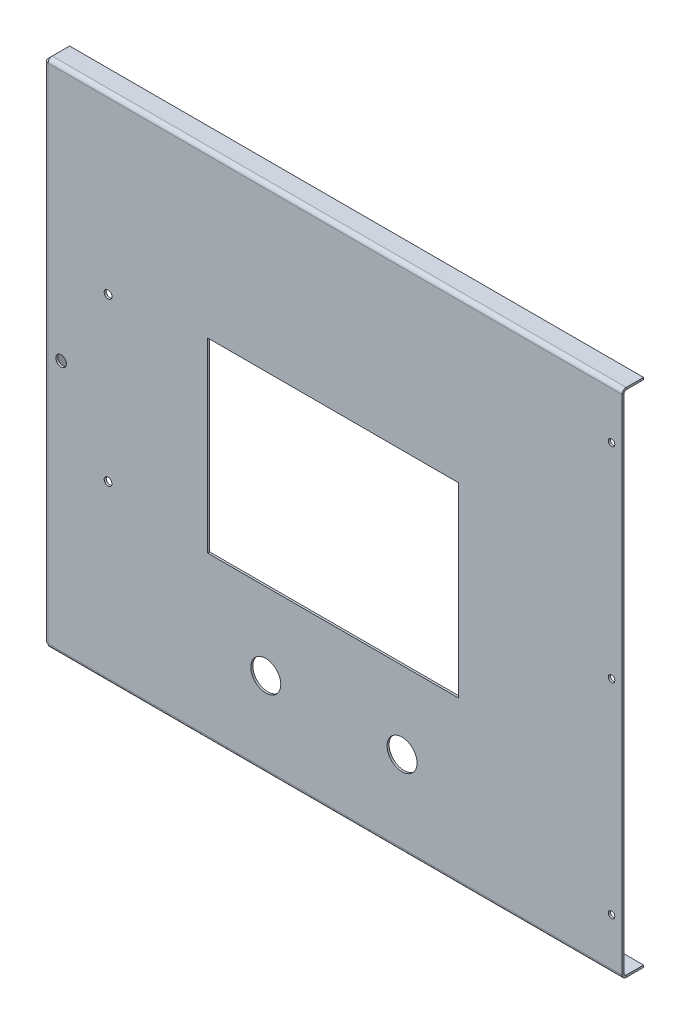
ISO-10303-21;
HEADER;
FILE_DESCRIPTION(('STEP AP214'),'2;1');
FILE_NAME('part.step','',(''),(''),'','','');
FILE_SCHEMA(('AUTOMOTIVE_DESIGN { 1 0 10303 214 1 1 1 1 }'));
ENDSEC;
DATA;
#1=APPLICATION_CONTEXT('core data for automotive mechanical design processes');
#2=APPLICATION_PROTOCOL_DEFINITION('international standard','automotive_design',2000,#1);
#3=PRODUCT_CONTEXT('',#1,'mechanical');
#4=PRODUCT('Part','Part','',(#3));
#5=PRODUCT_RELATED_PRODUCT_CATEGORY('part','',(#4));
#6=PRODUCT_DEFINITION_FORMATION('','',#4);
#7=PRODUCT_DEFINITION_CONTEXT('part definition',#1,'design');
#8=PRODUCT_DEFINITION('design','',#6,#7);
#9=PRODUCT_DEFINITION_SHAPE('','',#8);
#10=(LENGTH_UNIT() NAMED_UNIT(*) SI_UNIT(.MILLI.,.METRE.));
#11=(NAMED_UNIT(*) PLANE_ANGLE_UNIT() SI_UNIT($,.RADIAN.));
#12=(NAMED_UNIT(*) SI_UNIT($,.STERADIAN.) SOLID_ANGLE_UNIT());
#13=UNCERTAINTY_MEASURE_WITH_UNIT(LENGTH_MEASURE(1.E-05),#10,'distance_accuracy_value','');
#14=(GEOMETRIC_REPRESENTATION_CONTEXT(3) GLOBAL_UNCERTAINTY_ASSIGNED_CONTEXT((#13)) GLOBAL_UNIT_ASSIGNED_CONTEXT((#10,
#11,#12)) REPRESENTATION_CONTEXT('',''));
#15=CARTESIAN_POINT('',(0.,0.,0.));
#16=DIRECTION('',(0.,0.,1.));
#17=DIRECTION('',(1.,0.,0.));
#18=AXIS2_PLACEMENT_3D('',#15,#16,#17);
#19=CARTESIAN_POINT('',(0.,0.,-1.524));
#20=DIRECTION('',(0.,0.,-1.));
#21=DIRECTION('',(-1.,0.,0.));
#22=AXIS2_PLACEMENT_3D('',#19,#20,#21);
#23=PLANE('',#22);
#24=CARTESIAN_POINT('',(51.435,-127.,-1.524));
#25=DIRECTION('',(0.,0.,-1.));
#26=DIRECTION('',(-1.,0.,0.));
#27=AXIS2_PLACEMENT_3D('',#24,#25,#26);
#28=CIRCLE('',#27,11.176);
#29=CARTESIAN_POINT('',(40.259,-127.,-1.524));
#30=VERTEX_POINT('',#29);
#31=EDGE_CURVE('E320',#30,#30,#28,.T.);
#32=ORIENTED_EDGE('',*,*,#31,.F.);
#33=EDGE_LOOP('',(#32));
#34=FACE_BOUND('',#33,.T.);
#35=CARTESIAN_POINT('',(207.645,152.4,-1.524));
#36=DIRECTION('',(0.,0.,-1.));
#37=DIRECTION('',(-1.,0.,0.));
#38=AXIS2_PLACEMENT_3D('',#35,#36,#37);
#39=CIRCLE('',#38,2.413);
#40=CARTESIAN_POINT('',(205.232,152.4,-1.524));
#41=VERTEX_POINT('',#40);
#42=EDGE_CURVE('E316',#41,#41,#39,.T.);
#43=ORIENTED_EDGE('',*,*,#42,.F.);
#44=EDGE_LOOP('',(#43));
#45=FACE_BOUND('',#44,.T.);
#46=CARTESIAN_POINT('',(207.645,0.,-1.524));
#47=DIRECTION('',(0.,0.,-1.));
#48=DIRECTION('',(-1.,0.,0.));
#49=AXIS2_PLACEMENT_3D('',#46,#47,#48);
#50=CIRCLE('',#49,2.413);
#51=CARTESIAN_POINT('',(205.232,0.,-1.524));
#52=VERTEX_POINT('',#51);
#53=EDGE_CURVE('E312',#52,#52,#50,.T.);
#54=ORIENTED_EDGE('',*,*,#53,.F.);
#55=EDGE_LOOP('',(#54));
#56=FACE_BOUND('',#55,.T.);
#57=CARTESIAN_POINT('',(207.645,-152.4,-1.524));
#58=DIRECTION('',(0.,0.,-1.));
#59=DIRECTION('',(-1.,0.,0.));
#60=AXIS2_PLACEMENT_3D('',#57,#58,#59);
#61=CIRCLE('',#60,2.413);
#62=CARTESIAN_POINT('',(205.232,-152.4,-1.524));
#63=VERTEX_POINT('',#62);
#64=EDGE_CURVE('E308',#63,#63,#61,.T.);
#65=ORIENTED_EDGE('',*,*,#64,.F.);
#66=EDGE_LOOP('',(#65));
#67=FACE_BOUND('',#66,.T.);
#68=CARTESIAN_POINT('',(-50.165,-127.,-1.524));
#69=DIRECTION('',(0.,0.,-1.));
#70=DIRECTION('',(-1.,0.,0.));
#71=AXIS2_PLACEMENT_3D('',#68,#69,#70);
#72=CIRCLE('',#71,11.176);
#73=CARTESIAN_POINT('',(-61.341,-127.,-1.524));
#74=VERTEX_POINT('',#73);
#75=EDGE_CURVE('E304',#74,#74,#72,.T.);
#76=ORIENTED_EDGE('',*,*,#75,.F.);
#77=EDGE_LOOP('',(#76));
#78=FACE_BOUND('',#77,.T.);
#79=CARTESIAN_POINT('',(-167.767,-60.452,-1.524));
#80=DIRECTION('',(0.,0.,-1.));
#81=DIRECTION('',(-1.,0.,0.));
#82=AXIS2_PLACEMENT_3D('',#79,#80,#81);
#83=CIRCLE('',#82,2.8956);
#84=CARTESIAN_POINT('',(-170.6626,-60.452,-1.524));
#85=VERTEX_POINT('',#84);
#86=EDGE_CURVE('E300',#85,#85,#83,.T.);
#87=ORIENTED_EDGE('',*,*,#86,.F.);
#88=EDGE_LOOP('',(#87));
#89=FACE_BOUND('',#88,.T.);
#90=CARTESIAN_POINT('',(-167.767,60.452,-1.524));
#91=DIRECTION('',(0.,0.,-1.));
#92=DIRECTION('',(-1.,0.,0.));
#93=AXIS2_PLACEMENT_3D('',#90,#91,#92);
#94=CIRCLE('',#93,2.8956);
#95=CARTESIAN_POINT('',(-170.6626,60.452,-1.524));
#96=VERTEX_POINT('',#95);
#97=EDGE_CURVE('E296',#96,#96,#94,.T.);
#98=ORIENTED_EDGE('',*,*,#97,.F.);
#99=EDGE_LOOP('',(#98));
#100=FACE_BOUND('',#99,.T.);
#101=CARTESIAN_POINT('',(-202.819,0.,-1.524));
#102=DIRECTION('',(0.,0.,-1.));
#103=DIRECTION('',(-1.,0.,0.));
#104=AXIS2_PLACEMENT_3D('',#101,#102,#103);
#105=CIRCLE('',#104,3.9624);
#106=CARTESIAN_POINT('',(-206.7814,0.,-1.524));
#107=VERTEX_POINT('',#106);
#108=EDGE_CURVE('E292',#107,#107,#105,.T.);
#109=ORIENTED_EDGE('',*,*,#108,.F.);
#110=EDGE_LOOP('',(#109));
#111=FACE_BOUND('',#110,.T.);
#112=DIRECTION('',(0.,-1.,0.));
#113=VECTOR('',#112,1.);
#114=CARTESIAN_POINT('',(93.345,0.,-1.524));
#115=LINE('',#114,#113);
#116=CARTESIAN_POINT('',(93.345,69.469,-1.524));
#117=VERTEX_POINT('',#116);
#118=CARTESIAN_POINT('',(93.345,-69.469,-1.524));
#119=VERTEX_POINT('',#118);
#120=EDGE_CURVE('E289',#117,#119,#115,.T.);
#121=ORIENTED_EDGE('',*,*,#120,.F.);
#122=DIRECTION('',(1.,0.,0.));
#123=VECTOR('',#122,1.);
#124=CARTESIAN_POINT('',(0.,69.469,-1.524));
#125=LINE('',#124,#123);
#126=CARTESIAN_POINT('',(-93.599,69.469,-1.524));
#127=VERTEX_POINT('',#126);
#128=EDGE_CURVE('E277',#127,#117,#125,.T.);
#129=ORIENTED_EDGE('',*,*,#128,.F.);
#130=DIRECTION('',(0.,1.,0.));
#131=VECTOR('',#130,1.);
#132=CARTESIAN_POINT('',(-93.599,0.,-1.524));
#133=LINE('',#132,#131);
#134=CARTESIAN_POINT('',(-93.599,-69.469,-1.524));
#135=VERTEX_POINT('',#134);
#136=EDGE_CURVE('E249',#135,#127,#133,.T.);
#137=ORIENTED_EDGE('',*,*,#136,.F.);
#138=DIRECTION('',(-1.,0.,0.));
#139=VECTOR('',#138,1.);
#140=CARTESIAN_POINT('',(0.,-69.469,-1.524));
#141=LINE('',#140,#139);
#142=EDGE_CURVE('E286',#119,#135,#141,.T.);
#143=ORIENTED_EDGE('',*,*,#142,.F.);
#144=EDGE_LOOP('',(#121,#129,#137,#143));
#145=FACE_BOUND('',#144,.T.);
#146=DIRECTION('',(0.,1.,0.));
#147=VECTOR('',#146,1.);
#148=CARTESIAN_POINT('',(215.519,-190.5,-1.524));
#149=LINE('',#148,#147);
#150=CARTESIAN_POINT('',(215.519,-187.452,-1.524));
#151=VERTEX_POINT('',#150);
#152=CARTESIAN_POINT('',(215.519,187.452,-1.524));
#153=VERTEX_POINT('',#152);
#154=EDGE_CURVE('E13',#151,#153,#149,.T.);
#155=ORIENTED_EDGE('',*,*,#154,.F.);
#156=DIRECTION('',(1.,0.,0.));
#157=VECTOR('',#156,1.);
#158=CARTESIAN_POINT('',(-212.471,-187.452,-1.52400000000002));
#159=LINE('',#158,#157);
#160=CARTESIAN_POINT('',(-212.471,-187.452,-1.524));
#161=VERTEX_POINT('',#160);
#162=EDGE_CURVE('E522',#161,#151,#159,.T.);
#163=ORIENTED_EDGE('',*,*,#162,.F.);
#164=DIRECTION('',(0.,-1.,0.));
#165=VECTOR('',#164,1.);
#166=CARTESIAN_POINT('',(-212.471,187.452,-1.524));
#167=LINE('',#166,#165);
#168=CARTESIAN_POINT('',(-212.471,187.452,-1.524));
#169=VERTEX_POINT('',#168);
#170=EDGE_CURVE('E532',#169,#161,#167,.T.);
#171=ORIENTED_EDGE('',*,*,#170,.F.);
#172=DIRECTION('',(1.,0.,0.));
#173=VECTOR('',#172,1.);
#174=CARTESIAN_POINT('',(215.519,187.452,-1.524));
#175=LINE('',#174,#173);
#176=EDGE_CURVE('E511',#153,#169,#175,.F.);
#177=ORIENTED_EDGE('',*,*,#176,.F.);
#178=EDGE_LOOP('',(#155,#163,#171,#177));
#179=FACE_BOUND('',#178,.T.);
#180=ADVANCED_FACE('F106',(#34,#45,#56,#67,#78,#89,#100,#111,#145,#179),#23,.T.);
#181=CARTESIAN_POINT('',(0.,0.,0.));
#182=DIRECTION('',(0.,0.,-1.));
#183=DIRECTION('',(-1.,0.,0.));
#184=AXIS2_PLACEMENT_3D('',#181,#182,#183);
#185=PLANE('',#184);
#186=CARTESIAN_POINT('',(51.435,-127.,0.));
#187=DIRECTION('',(0.,0.,1.));
#188=DIRECTION('',(1.,0.,0.));
#189=AXIS2_PLACEMENT_3D('',#186,#187,#188);
#190=CIRCLE('',#189,11.176);
#191=CARTESIAN_POINT('',(62.611,-127.,0.));
#192=VERTEX_POINT('',#191);
#193=EDGE_CURVE('E1129',#192,#192,#190,.T.);
#194=ORIENTED_EDGE('',*,*,#193,.F.);
#195=EDGE_LOOP('',(#194));
#196=FACE_BOUND('',#195,.T.);
#197=CARTESIAN_POINT('',(207.645,152.4,0.));
#198=DIRECTION('',(0.,0.,1.));
#199=DIRECTION('',(1.,0.,0.));
#200=AXIS2_PLACEMENT_3D('',#197,#198,#199);
#201=CIRCLE('',#200,2.413);
#202=CARTESIAN_POINT('',(210.058,152.4,0.));
#203=VERTEX_POINT('',#202);
#204=EDGE_CURVE('E1132',#203,#203,#201,.T.);
#205=ORIENTED_EDGE('',*,*,#204,.F.);
#206=EDGE_LOOP('',(#205));
#207=FACE_BOUND('',#206,.T.);
#208=CARTESIAN_POINT('',(207.645,0.,0.));
#209=DIRECTION('',(0.,0.,1.));
#210=DIRECTION('',(1.,0.,0.));
#211=AXIS2_PLACEMENT_3D('',#208,#209,#210);
#212=CIRCLE('',#211,2.413);
#213=CARTESIAN_POINT('',(210.058,0.,0.));
#214=VERTEX_POINT('',#213);
#215=EDGE_CURVE('E1141',#214,#214,#212,.T.);
#216=ORIENTED_EDGE('',*,*,#215,.F.);
#217=EDGE_LOOP('',(#216));
#218=FACE_BOUND('',#217,.T.);
#219=CARTESIAN_POINT('',(207.645,-152.4,0.));
#220=DIRECTION('',(0.,0.,1.));
#221=DIRECTION('',(1.,0.,0.));
#222=AXIS2_PLACEMENT_3D('',#219,#220,#221);
#223=CIRCLE('',#222,2.413);
#224=CARTESIAN_POINT('',(210.058,-152.4,0.));
#225=VERTEX_POINT('',#224);
#226=EDGE_CURVE('E1144',#225,#225,#223,.T.);
#227=ORIENTED_EDGE('',*,*,#226,.F.);
#228=EDGE_LOOP('',(#227));
#229=FACE_BOUND('',#228,.T.);
#230=CARTESIAN_POINT('',(-50.165,-127.,0.));
#231=DIRECTION('',(0.,0.,1.));
#232=DIRECTION('',(1.,0.,0.));
#233=AXIS2_PLACEMENT_3D('',#230,#231,#232);
#234=CIRCLE('',#233,11.176);
#235=CARTESIAN_POINT('',(-38.989,-127.,0.));
#236=VERTEX_POINT('',#235);
#237=EDGE_CURVE('E1131',#236,#236,#234,.T.);
#238=ORIENTED_EDGE('',*,*,#237,.F.);
#239=EDGE_LOOP('',(#238));
#240=FACE_BOUND('',#239,.T.);
#241=CARTESIAN_POINT('',(-167.767,-60.452,0.));
#242=DIRECTION('',(0.,0.,1.));
#243=DIRECTION('',(1.,0.,0.));
#244=AXIS2_PLACEMENT_3D('',#241,#242,#243);
#245=CIRCLE('',#244,2.8956);
#246=CARTESIAN_POINT('',(-164.8714,-60.452,0.));
#247=VERTEX_POINT('',#246);
#248=EDGE_CURVE('E1137',#247,#247,#245,.T.);
#249=ORIENTED_EDGE('',*,*,#248,.F.);
#250=EDGE_LOOP('',(#249));
#251=FACE_BOUND('',#250,.T.);
#252=CARTESIAN_POINT('',(-167.767,60.452,0.));
#253=DIRECTION('',(0.,0.,1.));
#254=DIRECTION('',(1.,0.,0.));
#255=AXIS2_PLACEMENT_3D('',#252,#253,#254);
#256=CIRCLE('',#255,2.8956);
#257=CARTESIAN_POINT('',(-164.8714,60.452,0.));
#258=VERTEX_POINT('',#257);
#259=EDGE_CURVE('E1151',#258,#258,#256,.T.);
#260=ORIENTED_EDGE('',*,*,#259,.F.);
#261=EDGE_LOOP('',(#260));
#262=FACE_BOUND('',#261,.T.);
#263=CARTESIAN_POINT('',(-202.819,0.,0.));
#264=DIRECTION('',(0.,0.,1.));
#265=DIRECTION('',(1.,0.,0.));
#266=AXIS2_PLACEMENT_3D('',#263,#264,#265);
#267=CIRCLE('',#266,3.9624);
#268=CARTESIAN_POINT('',(-198.8566,0.,0.));
#269=VERTEX_POINT('',#268);
#270=EDGE_CURVE('E1147',#269,#269,#267,.T.);
#271=ORIENTED_EDGE('',*,*,#270,.F.);
#272=EDGE_LOOP('',(#271));
#273=FACE_BOUND('',#272,.T.);
#274=DIRECTION('',(-1.,0.,0.));
#275=VECTOR('',#274,1.);
#276=CARTESIAN_POINT('',(-93.599,69.469,0.));
#277=LINE('',#276,#275);
#278=CARTESIAN_POINT('',(93.345,69.469,0.));
#279=VERTEX_POINT('',#278);
#280=CARTESIAN_POINT('',(-93.599,69.469,0.));
#281=VERTEX_POINT('',#280);
#282=EDGE_CURVE('E256',#279,#281,#277,.T.);
#283=ORIENTED_EDGE('',*,*,#282,.F.);
#284=DIRECTION('',(0.,1.,0.));
#285=VECTOR('',#284,1.);
#286=CARTESIAN_POINT('',(93.345,-69.469,0.));
#287=LINE('',#286,#285);
#288=CARTESIAN_POINT('',(93.345,-69.469,0.));
#289=VERTEX_POINT('',#288);
#290=EDGE_CURVE('E130',#289,#279,#287,.T.);
#291=ORIENTED_EDGE('',*,*,#290,.F.);
#292=DIRECTION('',(1.,0.,0.));
#293=VECTOR('',#292,1.);
#294=CARTESIAN_POINT('',(-93.599,-69.469,0.));
#295=LINE('',#294,#293);
#296=CARTESIAN_POINT('',(-93.599,-69.469,0.));
#297=VERTEX_POINT('',#296);
#298=EDGE_CURVE('E264',#297,#289,#295,.T.);
#299=ORIENTED_EDGE('',*,*,#298,.F.);
#300=DIRECTION('',(0.,-1.,0.));
#301=VECTOR('',#300,1.);
#302=CARTESIAN_POINT('',(-93.599,-69.469,0.));
#303=LINE('',#302,#301);
#304=EDGE_CURVE('E246',#281,#297,#303,.T.);
#305=ORIENTED_EDGE('',*,*,#304,.F.);
#306=EDGE_LOOP('',(#283,#291,#299,#305));
#307=FACE_BOUND('',#306,.T.);
#308=DIRECTION('',(-1.,0.,0.));
#309=VECTOR('',#308,1.);
#310=CARTESIAN_POINT('',(0.,-187.452,0.));
#311=LINE('',#310,#309);
#312=CARTESIAN_POINT('',(215.519,-187.452,0.));
#313=VERTEX_POINT('',#312);
#314=CARTESIAN_POINT('',(-212.471,-187.452,0.));
#315=VERTEX_POINT('',#314);
#316=EDGE_CURVE('E528',#313,#315,#311,.T.);
#317=ORIENTED_EDGE('',*,*,#316,.F.);
#318=DIRECTION('',(0.,1.,0.));
#319=VECTOR('',#318,1.);
#320=CARTESIAN_POINT('',(215.519,-190.5,0.));
#321=LINE('',#320,#319);
#322=CARTESIAN_POINT('',(215.519,187.452,0.));
#323=VERTEX_POINT('',#322);
#324=EDGE_CURVE('E110',#313,#323,#321,.T.);
#325=ORIENTED_EDGE('',*,*,#324,.T.);
#326=DIRECTION('',(1.,0.,0.));
#327=VECTOR('',#326,1.);
#328=CARTESIAN_POINT('',(215.519,187.452,0.));
#329=LINE('',#328,#327);
#330=CARTESIAN_POINT('',(-212.471,187.452,0.));
#331=VERTEX_POINT('',#330);
#332=EDGE_CURVE('E494',#323,#331,#329,.F.);
#333=ORIENTED_EDGE('',*,*,#332,.T.);
#334=DIRECTION('',(0.,1.,0.));
#335=VECTOR('',#334,1.);
#336=CARTESIAN_POINT('',(-212.471,0.,0.));
#337=LINE('',#336,#335);
#338=EDGE_CURVE('E535',#315,#331,#337,.T.);
#339=ORIENTED_EDGE('',*,*,#338,.F.);
#340=EDGE_LOOP('',(#317,#325,#333,#339));
#341=FACE_BOUND('',#340,.T.);
#342=ADVANCED_FACE('F261',(#196,#207,#218,#229,#240,#251,#262,#273,#307,#341),#185,.F.);
#343=CARTESIAN_POINT('',(215.519,-190.5,-1.524));
#344=DIRECTION('',(1.,0.,0.));
#345=DIRECTION('',(0.,0.,-1.));
#346=AXIS2_PLACEMENT_3D('',#343,#344,#345);
#347=PLANE('',#346);
#348=DIRECTION('',(0.,0.,1.));
#349=VECTOR('',#348,1.);
#350=CARTESIAN_POINT('',(215.519,-187.452,-1.524));
#351=LINE('',#350,#349);
#352=EDGE_CURVE('E372',#151,#313,#351,.T.);
#353=ORIENTED_EDGE('',*,*,#352,.F.);
#354=ORIENTED_EDGE('',*,*,#154,.T.);
#355=DIRECTION('',(0.,0.,1.));
#356=VECTOR('',#355,1.);
#357=CARTESIAN_POINT('',(215.519,187.452,-1.524));
#358=LINE('',#357,#356);
#359=EDGE_CURVE('E503',#153,#323,#358,.T.);
#360=ORIENTED_EDGE('',*,*,#359,.T.);
#361=ORIENTED_EDGE('',*,*,#324,.F.);
#362=EDGE_LOOP('',(#353,#354,#360,#361));
#363=FACE_BOUND('',#362,.T.);
#364=ADVANCED_FACE('F108',(#363),#347,.T.);
#365=CARTESIAN_POINT('',(-212.471,187.452,-3.048));
#366=DIRECTION('',(-1.,0.,0.));
#367=DIRECTION('',(0.,0.,1.));
#368=AXIS2_PLACEMENT_3D('',#365,#366,#367);
#369=PLANE('',#368);
#370=DIRECTION('',(0.,1.,0.));
#371=VECTOR('',#370,1.);
#372=CARTESIAN_POINT('',(-212.471,190.5,-3.04799999999999));
#373=LINE('',#372,#371);
#374=CARTESIAN_POINT('',(-212.471,188.976,-3.048));
#375=VERTEX_POINT('',#374);
#376=CARTESIAN_POINT('',(-212.471,190.5,-3.04799999999999));
#377=VERTEX_POINT('',#376);
#378=EDGE_CURVE('E449',#375,#377,#373,.T.);
#379=ORIENTED_EDGE('',*,*,#378,.F.);
#380=CARTESIAN_POINT('',(-212.471,187.452,-3.048));
#381=DIRECTION('',(1.,0.,0.));
#382=DIRECTION('',(0.,0.,-1.));
#383=AXIS2_PLACEMENT_3D('',#380,#381,#382);
#384=CIRCLE('',#383,1.524);
#385=EDGE_CURVE('E507',#169,#375,#384,.F.);
#386=ORIENTED_EDGE('',*,*,#385,.F.);
#387=DIRECTION('',(0.,0.,1.));
#388=VECTOR('',#387,1.);
#389=CARTESIAN_POINT('',(-212.471,187.452,-1.524));
#390=LINE('',#389,#388);
#391=EDGE_CURVE('E518',#169,#331,#390,.T.);
#392=ORIENTED_EDGE('',*,*,#391,.T.);
#393=CARTESIAN_POINT('',(-212.471,187.452,-3.048));
#394=DIRECTION('',(1.,0.,0.));
#395=DIRECTION('',(0.,0.,-1.));
#396=AXIS2_PLACEMENT_3D('',#393,#394,#395);
#397=CIRCLE('',#396,3.048);
#398=EDGE_CURVE('E498',#331,#377,#397,.F.);
#399=ORIENTED_EDGE('',*,*,#398,.T.);
#400=EDGE_LOOP('',(#379,#386,#392,#399));
#401=FACE_BOUND('',#400,.T.);
#402=ADVANCED_FACE('F572',(#401),#369,.T.);
#403=CARTESIAN_POINT('',(215.519,187.452,-3.048));
#404=DIRECTION('',(-1.,0.,0.));
#405=DIRECTION('',(0.,0.,1.));
#406=AXIS2_PLACEMENT_3D('',#403,#404,#405);
#407=PLANE('',#406);
#408=CARTESIAN_POINT('',(215.519,187.452,-3.048));
#409=DIRECTION('',(1.,0.,0.));
#410=DIRECTION('',(0.,0.,-1.));
#411=AXIS2_PLACEMENT_3D('',#408,#409,#410);
#412=CIRCLE('',#411,1.524);
#413=CARTESIAN_POINT('',(215.519,188.976,-3.048));
#414=VERTEX_POINT('',#413);
#415=EDGE_CURVE('E453',#414,#153,#412,.T.);
#416=ORIENTED_EDGE('',*,*,#415,.F.);
#417=DIRECTION('',(0.,1.,0.));
#418=VECTOR('',#417,1.);
#419=CARTESIAN_POINT('',(215.519,188.976,-3.048));
#420=LINE('',#419,#418);
#421=CARTESIAN_POINT('',(215.519,190.5,-3.04799999999999));
#422=VERTEX_POINT('',#421);
#423=EDGE_CURVE('E484',#414,#422,#420,.T.);
#424=ORIENTED_EDGE('',*,*,#423,.T.);
#425=CARTESIAN_POINT('',(215.519,187.452,-3.048));
#426=DIRECTION('',(1.,0.,0.));
#427=DIRECTION('',(0.,0.,-1.));
#428=AXIS2_PLACEMENT_3D('',#425,#426,#427);
#429=CIRCLE('',#428,3.048);
#430=EDGE_CURVE('E499',#422,#323,#429,.T.);
#431=ORIENTED_EDGE('',*,*,#430,.T.);
#432=ORIENTED_EDGE('',*,*,#359,.F.);
#433=EDGE_LOOP('',(#416,#424,#431,#432));
#434=FACE_BOUND('',#433,.T.);
#435=ADVANCED_FACE('F553',(#434),#407,.F.);
#436=CARTESIAN_POINT('',(215.519,187.452,-3.048));
#437=DIRECTION('',(1.,0.,0.));
#438=DIRECTION('',(0.,1.,0.));
#439=AXIS2_PLACEMENT_3D('',#436,#437,#438);
#440=CYLINDRICAL_SURFACE('',#439,3.048);
#441=ORIENTED_EDGE('',*,*,#332,.F.);
#442=ORIENTED_EDGE('',*,*,#430,.F.);
#443=DIRECTION('',(1.,0.,0.));
#444=VECTOR('',#443,1.);
#445=CARTESIAN_POINT('',(0.,190.5,-3.04799999999999));
#446=LINE('',#445,#444);
#447=EDGE_CURVE('E480',#377,#422,#446,.T.);
#448=ORIENTED_EDGE('',*,*,#447,.F.);
#449=ORIENTED_EDGE('',*,*,#398,.F.);
#450=EDGE_LOOP('',(#441,#442,#448,#449));
#451=FACE_BOUND('',#450,.T.);
#452=ADVANCED_FACE('F549',(#451),#440,.T.);
#453=CARTESIAN_POINT('',(215.519,187.452,-3.048));
#454=DIRECTION('',(1.,0.,0.));
#455=DIRECTION('',(0.,1.,0.));
#456=AXIS2_PLACEMENT_3D('',#453,#454,#455);
#457=CYLINDRICAL_SURFACE('',#456,1.524);
#458=ORIENTED_EDGE('',*,*,#176,.T.);
#459=ORIENTED_EDGE('',*,*,#385,.T.);
#460=DIRECTION('',(-1.,0.,0.));
#461=VECTOR('',#460,1.);
#462=CARTESIAN_POINT('',(-212.471,188.976,-3.048));
#463=LINE('',#462,#461);
#464=EDGE_CURVE('E488',#375,#414,#463,.F.);
#465=ORIENTED_EDGE('',*,*,#464,.T.);
#466=ORIENTED_EDGE('',*,*,#415,.T.);
#467=EDGE_LOOP('',(#458,#459,#465,#466));
#468=FACE_BOUND('',#467,.T.);
#469=ADVANCED_FACE('F576',(#468),#457,.F.);
#470=CARTESIAN_POINT('',(215.519,190.5,-1.52399999999999));
#471=DIRECTION('',(1.,0.,0.));
#472=DIRECTION('',(0.,0.,-1.));
#473=AXIS2_PLACEMENT_3D('',#470,#471,#472);
#474=PLANE('',#473);
#475=DIRECTION('',(0.,0.,1.));
#476=VECTOR('',#475,1.);
#477=CARTESIAN_POINT('',(215.519,190.5,-1.52399999999999));
#478=LINE('',#477,#476);
#479=CARTESIAN_POINT('',(215.519,190.5,-16.002));
#480=VERTEX_POINT('',#479);
#481=EDGE_CURVE('E458',#480,#422,#478,.T.);
#482=ORIENTED_EDGE('',*,*,#481,.T.);
#483=ORIENTED_EDGE('',*,*,#423,.F.);
#484=DIRECTION('',(0.,0.,-1.));
#485=VECTOR('',#484,1.);
#486=CARTESIAN_POINT('',(215.519,188.976,7.30409884621813E-13));
#487=LINE('',#486,#485);
#488=CARTESIAN_POINT('',(215.519,188.976,-16.002));
#489=VERTEX_POINT('',#488);
#490=EDGE_CURVE('E469',#489,#414,#487,.F.);
#491=ORIENTED_EDGE('',*,*,#490,.F.);
#492=DIRECTION('',(0.,-1.,0.));
#493=VECTOR('',#492,1.);
#494=CARTESIAN_POINT('',(215.519,190.5,-16.002));
#495=LINE('',#494,#493);
#496=EDGE_CURVE('E450',#480,#489,#495,.T.);
#497=ORIENTED_EDGE('',*,*,#496,.F.);
#498=EDGE_LOOP('',(#482,#483,#491,#497));
#499=FACE_BOUND('',#498,.T.);
#500=ADVANCED_FACE('F562',(#499),#474,.T.);
#501=CARTESIAN_POINT('',(-212.471,190.5,-16.002));
#502=DIRECTION('',(-1.,0.,0.));
#503=DIRECTION('',(0.,0.,1.));
#504=AXIS2_PLACEMENT_3D('',#501,#502,#503);
#505=PLANE('',#504);
#506=DIRECTION('',(0.,0.,1.));
#507=VECTOR('',#506,1.);
#508=CARTESIAN_POINT('',(-212.471,188.976,7.30409884621813E-13));
#509=LINE('',#508,#507);
#510=CARTESIAN_POINT('',(-212.471,188.976,-16.002));
#511=VERTEX_POINT('',#510);
#512=EDGE_CURVE('E477',#375,#511,#509,.F.);
#513=ORIENTED_EDGE('',*,*,#512,.F.);
#514=ORIENTED_EDGE('',*,*,#378,.T.);
#515=DIRECTION('',(0.,0.,-1.));
#516=VECTOR('',#515,1.);
#517=CARTESIAN_POINT('',(-212.471,190.5,-16.002));
#518=LINE('',#517,#516);
#519=CARTESIAN_POINT('',(-212.471,190.5,-16.002));
#520=VERTEX_POINT('',#519);
#521=EDGE_CURVE('E466',#377,#520,#518,.T.);
#522=ORIENTED_EDGE('',*,*,#521,.T.);
#523=DIRECTION('',(0.,-1.,0.));
#524=VECTOR('',#523,1.);
#525=CARTESIAN_POINT('',(-212.471,190.5,-16.002));
#526=LINE('',#525,#524);
#527=EDGE_CURVE('E454',#520,#511,#526,.T.);
#528=ORIENTED_EDGE('',*,*,#527,.T.);
#529=EDGE_LOOP('',(#513,#514,#522,#528));
#530=FACE_BOUND('',#529,.T.);
#531=ADVANCED_FACE('F569',(#530),#505,.T.);
#532=CARTESIAN_POINT('',(0.,190.5,7.3573090218221E-13));
#533=DIRECTION('',(0.,1.,0.));
#534=DIRECTION('',(0.,0.,1.));
#535=AXIS2_PLACEMENT_3D('',#532,#533,#534);
#536=PLANE('',#535);
#537=ORIENTED_EDGE('',*,*,#521,.F.);
#538=ORIENTED_EDGE('',*,*,#447,.T.);
#539=ORIENTED_EDGE('',*,*,#481,.F.);
#540=DIRECTION('',(1.,0.,0.));
#541=VECTOR('',#540,1.);
#542=CARTESIAN_POINT('',(215.519,190.5,-16.002));
#543=LINE('',#542,#541);
#544=EDGE_CURVE('E462',#520,#480,#543,.T.);
#545=ORIENTED_EDGE('',*,*,#544,.F.);
#546=EDGE_LOOP('',(#537,#538,#539,#545));
#547=FACE_BOUND('',#546,.T.);
#548=ADVANCED_FACE('F560',(#547),#536,.T.);
#549=CARTESIAN_POINT('',(0.,188.976,7.30409884621813E-13));
#550=DIRECTION('',(0.,1.,0.));
#551=DIRECTION('',(0.,0.,1.));
#552=AXIS2_PLACEMENT_3D('',#549,#550,#551);
#553=PLANE('',#552);
#554=ORIENTED_EDGE('',*,*,#464,.F.);
#555=ORIENTED_EDGE('',*,*,#512,.T.);
#556=DIRECTION('',(-1.,0.,0.));
#557=VECTOR('',#556,1.);
#558=CARTESIAN_POINT('',(0.,188.976,-16.002));
#559=LINE('',#558,#557);
#560=EDGE_CURVE('E473',#511,#489,#559,.F.);
#561=ORIENTED_EDGE('',*,*,#560,.T.);
#562=ORIENTED_EDGE('',*,*,#490,.T.);
#563=EDGE_LOOP('',(#554,#555,#561,#562));
#564=FACE_BOUND('',#563,.T.);
#565=ADVANCED_FACE('F579',(#564),#553,.F.);
#566=CARTESIAN_POINT('',(215.519,190.5,-16.002));
#567=DIRECTION('',(0.,0.,-1.));
#568=DIRECTION('',(0.,1.,0.));
#569=AXIS2_PLACEMENT_3D('',#566,#567,#568);
#570=PLANE('',#569);
#571=ORIENTED_EDGE('',*,*,#560,.F.);
#572=ORIENTED_EDGE('',*,*,#527,.F.);
#573=ORIENTED_EDGE('',*,*,#544,.T.);
#574=ORIENTED_EDGE('',*,*,#496,.T.);
#575=EDGE_LOOP('',(#571,#572,#573,#574));
#576=FACE_BOUND('',#575,.T.);
#577=ADVANCED_FACE('F566',(#576),#570,.T.);
#578=CARTESIAN_POINT('',(-212.471,-187.452,-3.04799999999999));
#579=DIRECTION('',(0.,-1.,0.));
#580=DIRECTION('',(0.,0.,-1.));
#581=AXIS2_PLACEMENT_3D('',#578,#579,#580);
#582=PLANE('',#581);
#583=DIRECTION('',(-1.,0.,0.));
#584=VECTOR('',#583,1.);
#585=CARTESIAN_POINT('',(-215.519,-187.452,-3.04799999999999));
#586=LINE('',#585,#584);
#587=CARTESIAN_POINT('',(-213.995,-187.452,-3.04799999999998));
#588=VERTEX_POINT('',#587);
#589=CARTESIAN_POINT('',(-215.519,-187.452,-3.04799999999998));
#590=VERTEX_POINT('',#589);
#591=EDGE_CURVE('E387',#588,#590,#586,.T.);
#592=ORIENTED_EDGE('',*,*,#591,.F.);
#593=CARTESIAN_POINT('',(-212.471,-187.452,-3.04799999999999));
#594=DIRECTION('',(0.,1.,0.));
#595=DIRECTION('',(0.,0.,1.));
#596=AXIS2_PLACEMENT_3D('',#593,#594,#595);
#597=CIRCLE('',#596,1.52399999999997);
#598=EDGE_CURVE('E439',#161,#588,#597,.F.);
#599=ORIENTED_EDGE('',*,*,#598,.F.);
#600=DIRECTION('',(0.,0.,1.));
#601=VECTOR('',#600,1.);
#602=CARTESIAN_POINT('',(-212.471,-187.452,-1.52400000000002));
#603=LINE('',#602,#601);
#604=EDGE_CURVE('E434',#161,#315,#603,.T.);
#605=ORIENTED_EDGE('',*,*,#604,.T.);
#606=CARTESIAN_POINT('',(-212.471,-187.452,-3.04799999999999));
#607=DIRECTION('',(0.,1.,0.));
#608=DIRECTION('',(0.,0.,1.));
#609=AXIS2_PLACEMENT_3D('',#606,#607,#608);
#610=CIRCLE('',#609,3.04799999999997);
#611=EDGE_CURVE('E430',#315,#590,#610,.F.);
#612=ORIENTED_EDGE('',*,*,#611,.T.);
#613=EDGE_LOOP('',(#592,#599,#605,#612));
#614=FACE_BOUND('',#613,.T.);
#615=ADVANCED_FACE('F585',(#614),#582,.T.);
#616=CARTESIAN_POINT('',(-212.471,187.452,-3.04800000000004));
#617=DIRECTION('',(0.,-1.,0.));
#618=DIRECTION('',(0.,0.,-1.));
#619=AXIS2_PLACEMENT_3D('',#616,#617,#618);
#620=PLANE('',#619);
#621=CARTESIAN_POINT('',(-212.471,187.452,-3.04800000000004));
#622=DIRECTION('',(0.,1.,0.));
#623=DIRECTION('',(0.,0.,1.));
#624=AXIS2_PLACEMENT_3D('',#621,#622,#623);
#625=CIRCLE('',#624,1.52399999999997);
#626=CARTESIAN_POINT('',(-213.995,187.452,-3.04800000000004));
#627=VERTEX_POINT('',#626);
#628=EDGE_CURVE('E391',#627,#169,#625,.T.);
#629=ORIENTED_EDGE('',*,*,#628,.F.);
#630=DIRECTION('',(-1.,0.,0.));
#631=VECTOR('',#630,1.);
#632=CARTESIAN_POINT('',(-213.995,187.452,-3.04800000000002));
#633=LINE('',#632,#631);
#634=CARTESIAN_POINT('',(-215.519,187.452,-3.04800000000002));
#635=VERTEX_POINT('',#634);
#636=EDGE_CURVE('E420',#627,#635,#633,.T.);
#637=ORIENTED_EDGE('',*,*,#636,.T.);
#638=CARTESIAN_POINT('',(-212.471,187.452,-3.04800000000004));
#639=DIRECTION('',(0.,1.,0.));
#640=DIRECTION('',(0.,0.,1.));
#641=AXIS2_PLACEMENT_3D('',#638,#639,#640);
#642=CIRCLE('',#641,3.04799999999997);
#643=EDGE_CURVE('E435',#635,#331,#642,.T.);
#644=ORIENTED_EDGE('',*,*,#643,.T.);
#645=ORIENTED_EDGE('',*,*,#391,.F.);
#646=EDGE_LOOP('',(#629,#637,#644,#645));
#647=FACE_BOUND('',#646,.T.);
#648=ADVANCED_FACE('F637',(#647),#620,.F.);
#649=CARTESIAN_POINT('',(-212.471,187.452,-3.04800000000004));
#650=DIRECTION('',(0.,1.,0.));
#651=DIRECTION('',(-1.,0.,0.));
#652=AXIS2_PLACEMENT_3D('',#649,#650,#651);
#653=CYLINDRICAL_SURFACE('',#652,3.04799999999997);
#654=ORIENTED_EDGE('',*,*,#338,.T.);
#655=ORIENTED_EDGE('',*,*,#643,.F.);
#656=DIRECTION('',(0.,1.,0.));
#657=VECTOR('',#656,1.);
#658=CARTESIAN_POINT('',(-215.519,-187.452,-3.04799999999999));
#659=LINE('',#658,#657);
#660=EDGE_CURVE('E417',#635,#590,#659,.F.);
#661=ORIENTED_EDGE('',*,*,#660,.T.);
#662=ORIENTED_EDGE('',*,*,#611,.F.);
#663=EDGE_LOOP('',(#654,#655,#661,#662));
#664=FACE_BOUND('',#663,.T.);
#665=ADVANCED_FACE('F647',(#664),#653,.T.);
#666=CARTESIAN_POINT('',(-212.471,187.452,-3.04800000000004));
#667=DIRECTION('',(0.,1.,0.));
#668=DIRECTION('',(-1.,0.,0.));
#669=AXIS2_PLACEMENT_3D('',#666,#667,#668);
#670=CYLINDRICAL_SURFACE('',#669,1.52399999999997);
#671=ORIENTED_EDGE('',*,*,#170,.T.);
#672=ORIENTED_EDGE('',*,*,#598,.T.);
#673=DIRECTION('',(0.,1.,0.));
#674=VECTOR('',#673,1.);
#675=CARTESIAN_POINT('',(-213.995,-187.452,-3.048));
#676=LINE('',#675,#674);
#677=EDGE_CURVE('E424',#588,#627,#676,.T.);
#678=ORIENTED_EDGE('',*,*,#677,.T.);
#679=ORIENTED_EDGE('',*,*,#628,.T.);
#680=EDGE_LOOP('',(#671,#672,#678,#679));
#681=FACE_BOUND('',#680,.T.);
#682=ADVANCED_FACE('F657',(#681),#670,.F.);
#683=CARTESIAN_POINT('',(-215.519,-187.452,-1.52399999999999));
#684=DIRECTION('',(0.,-1.,0.));
#685=DIRECTION('',(1.,0.,0.));
#686=AXIS2_PLACEMENT_3D('',#683,#684,#685);
#687=PLANE('',#686);
#688=DIRECTION('',(0.,0.,-1.));
#689=VECTOR('',#688,1.);
#690=CARTESIAN_POINT('',(-213.995,-187.452,8.26337049468811E-13));
#691=LINE('',#690,#689);
#692=CARTESIAN_POINT('',(-213.995,-187.452,-16.002));
#693=VERTEX_POINT('',#692);
#694=EDGE_CURVE('E414',#588,#693,#691,.T.);
#695=ORIENTED_EDGE('',*,*,#694,.F.);
#696=ORIENTED_EDGE('',*,*,#591,.T.);
#697=DIRECTION('',(0.,0.,1.));
#698=VECTOR('',#697,1.);
#699=CARTESIAN_POINT('',(-215.519,-187.452,-1.52399999999999));
#700=LINE('',#699,#698);
#701=CARTESIAN_POINT('',(-215.519,-187.452,-16.002));
#702=VERTEX_POINT('',#701);
#703=EDGE_CURVE('E403',#590,#702,#700,.F.);
#704=ORIENTED_EDGE('',*,*,#703,.T.);
#705=DIRECTION('',(1.,0.,0.));
#706=VECTOR('',#705,1.);
#707=CARTESIAN_POINT('',(-215.519,-187.452,-16.002));
#708=LINE('',#707,#706);
#709=EDGE_CURVE('E392',#702,#693,#708,.T.);
#710=ORIENTED_EDGE('',*,*,#709,.T.);
#711=EDGE_LOOP('',(#695,#696,#704,#710));
#712=FACE_BOUND('',#711,.T.);
#713=ADVANCED_FACE('F666',(#712),#687,.T.);
#714=CARTESIAN_POINT('',(-215.519,187.452,-16.002));
#715=DIRECTION('',(0.,1.,0.));
#716=DIRECTION('',(-1.,0.,0.));
#717=AXIS2_PLACEMENT_3D('',#714,#715,#716);
#718=PLANE('',#717);
#719=DIRECTION('',(0.,0.,-1.));
#720=VECTOR('',#719,1.);
#721=CARTESIAN_POINT('',(-215.519,187.452,-16.002));
#722=LINE('',#721,#720);
#723=CARTESIAN_POINT('',(-215.519,187.452,-16.002));
#724=VERTEX_POINT('',#723);
#725=EDGE_CURVE('E396',#724,#635,#722,.F.);
#726=ORIENTED_EDGE('',*,*,#725,.T.);
#727=ORIENTED_EDGE('',*,*,#636,.F.);
#728=DIRECTION('',(0.,0.,1.));
#729=VECTOR('',#728,1.);
#730=CARTESIAN_POINT('',(-213.995,187.452,8.26337049468811E-13));
#731=LINE('',#730,#729);
#732=CARTESIAN_POINT('',(-213.995,187.452,-16.002));
#733=VERTEX_POINT('',#732);
#734=EDGE_CURVE('E406',#733,#627,#731,.T.);
#735=ORIENTED_EDGE('',*,*,#734,.F.);
#736=DIRECTION('',(1.,0.,0.));
#737=VECTOR('',#736,1.);
#738=CARTESIAN_POINT('',(-215.519,187.452,-16.002));
#739=LINE('',#738,#737);
#740=EDGE_CURVE('E388',#724,#733,#739,.T.);
#741=ORIENTED_EDGE('',*,*,#740,.F.);
#742=EDGE_LOOP('',(#726,#727,#735,#741));
#743=FACE_BOUND('',#742,.T.);
#744=ADVANCED_FACE('F676',(#743),#718,.T.);
#745=CARTESIAN_POINT('',(-215.519,0.,8.31658067029208E-13));
#746=DIRECTION('',(1.,0.,0.));
#747=DIRECTION('',(0.,0.,-1.));
#748=AXIS2_PLACEMENT_3D('',#745,#746,#747);
#749=PLANE('',#748);
#750=ORIENTED_EDGE('',*,*,#660,.F.);
#751=ORIENTED_EDGE('',*,*,#725,.F.);
#752=DIRECTION('',(0.,-1.,0.));
#753=VECTOR('',#752,1.);
#754=CARTESIAN_POINT('',(-215.519,-187.452,-16.002));
#755=LINE('',#754,#753);
#756=EDGE_CURVE('E399',#702,#724,#755,.F.);
#757=ORIENTED_EDGE('',*,*,#756,.F.);
#758=ORIENTED_EDGE('',*,*,#703,.F.);
#759=EDGE_LOOP('',(#750,#751,#757,#758));
#760=FACE_BOUND('',#759,.T.);
#761=ADVANCED_FACE('F686',(#760),#749,.F.);
#762=CARTESIAN_POINT('',(-213.995,0.,8.26337049468811E-13));
#763=DIRECTION('',(1.,0.,0.));
#764=DIRECTION('',(0.,0.,-1.));
#765=AXIS2_PLACEMENT_3D('',#762,#763,#764);
#766=PLANE('',#765);
#767=ORIENTED_EDGE('',*,*,#734,.T.);
#768=ORIENTED_EDGE('',*,*,#677,.F.);
#769=ORIENTED_EDGE('',*,*,#694,.T.);
#770=DIRECTION('',(0.,1.,0.));
#771=VECTOR('',#770,1.);
#772=CARTESIAN_POINT('',(-213.995,0.,-16.002));
#773=LINE('',#772,#771);
#774=EDGE_CURVE('E410',#693,#733,#773,.T.);
#775=ORIENTED_EDGE('',*,*,#774,.T.);
#776=EDGE_LOOP('',(#767,#768,#769,#775));
#777=FACE_BOUND('',#776,.T.);
#778=ADVANCED_FACE('F696',(#777),#766,.T.);
#779=CARTESIAN_POINT('',(-215.519,-187.452,-16.002));
#780=DIRECTION('',(0.,0.,-1.));
#781=DIRECTION('',(-1.,0.,0.));
#782=AXIS2_PLACEMENT_3D('',#779,#780,#781);
#783=PLANE('',#782);
#784=ORIENTED_EDGE('',*,*,#774,.F.);
#785=ORIENTED_EDGE('',*,*,#709,.F.);
#786=ORIENTED_EDGE('',*,*,#756,.T.);
#787=ORIENTED_EDGE('',*,*,#740,.T.);
#788=EDGE_LOOP('',(#784,#785,#786,#787));
#789=FACE_BOUND('',#788,.T.);
#790=ADVANCED_FACE('F706',(#789),#783,.T.);
#791=CARTESIAN_POINT('',(215.519,-187.452,-3.048));
#792=DIRECTION('',(1.,0.,0.));
#793=DIRECTION('',(0.,0.,-1.));
#794=AXIS2_PLACEMENT_3D('',#791,#792,#793);
#795=PLANE('',#794);
#796=DIRECTION('',(0.,-1.,0.));
#797=VECTOR('',#796,1.);
#798=CARTESIAN_POINT('',(215.519,-190.5,-3.04799999999999));
#799=LINE('',#798,#797);
#800=CARTESIAN_POINT('',(215.519,-188.976,-3.048));
#801=VERTEX_POINT('',#800);
#802=CARTESIAN_POINT('',(215.519,-190.5,-3.04799999999999));
#803=VERTEX_POINT('',#802);
#804=EDGE_CURVE('E324',#801,#803,#799,.T.);
#805=ORIENTED_EDGE('',*,*,#804,.F.);
#806=CARTESIAN_POINT('',(215.519,-187.452,-3.048));
#807=DIRECTION('',(-1.,0.,0.));
#808=DIRECTION('',(0.,0.,1.));
#809=AXIS2_PLACEMENT_3D('',#806,#807,#808);
#810=CIRCLE('',#809,1.524);
#811=EDGE_CURVE('E377',#151,#801,#810,.F.);
#812=ORIENTED_EDGE('',*,*,#811,.F.);
#813=ORIENTED_EDGE('',*,*,#352,.T.);
#814=CARTESIAN_POINT('',(215.519,-187.452,-3.048));
#815=DIRECTION('',(-1.,0.,0.));
#816=DIRECTION('',(0.,0.,1.));
#817=AXIS2_PLACEMENT_3D('',#814,#815,#816);
#818=CIRCLE('',#817,3.048);
#819=EDGE_CURVE('E368',#313,#803,#818,.F.);
#820=ORIENTED_EDGE('',*,*,#819,.T.);
#821=EDGE_LOOP('',(#805,#812,#813,#820));
#822=FACE_BOUND('',#821,.T.);
#823=ADVANCED_FACE('F716',(#822),#795,.T.);
#824=CARTESIAN_POINT('',(-212.471,-187.452,-3.048));
#825=DIRECTION('',(1.,0.,0.));
#826=DIRECTION('',(0.,0.,-1.));
#827=AXIS2_PLACEMENT_3D('',#824,#825,#826);
#828=PLANE('',#827);
#829=CARTESIAN_POINT('',(-212.471,-187.452,-3.048));
#830=DIRECTION('',(-1.,0.,0.));
#831=DIRECTION('',(0.,0.,1.));
#832=AXIS2_PLACEMENT_3D('',#829,#830,#831);
#833=CIRCLE('',#832,1.524);
#834=CARTESIAN_POINT('',(-212.471,-188.976,-3.048));
#835=VERTEX_POINT('',#834);
#836=EDGE_CURVE('E328',#835,#161,#833,.T.);
#837=ORIENTED_EDGE('',*,*,#836,.F.);
#838=DIRECTION('',(0.,-1.,0.));
#839=VECTOR('',#838,1.);
#840=CARTESIAN_POINT('',(-212.471,-188.976,-3.048));
#841=LINE('',#840,#839);
#842=CARTESIAN_POINT('',(-212.471,-190.5,-3.04799999999999));
#843=VERTEX_POINT('',#842);
#844=EDGE_CURVE('E358',#835,#843,#841,.T.);
#845=ORIENTED_EDGE('',*,*,#844,.T.);
#846=CARTESIAN_POINT('',(-212.471,-187.452,-3.048));
#847=DIRECTION('',(-1.,0.,0.));
#848=DIRECTION('',(0.,0.,1.));
#849=AXIS2_PLACEMENT_3D('',#846,#847,#848);
#850=CIRCLE('',#849,3.048);
#851=EDGE_CURVE('E373',#843,#315,#850,.T.);
#852=ORIENTED_EDGE('',*,*,#851,.T.);
#853=ORIENTED_EDGE('',*,*,#604,.F.);
#854=EDGE_LOOP('',(#837,#845,#852,#853));
#855=FACE_BOUND('',#854,.T.);
#856=ADVANCED_FACE('F726',(#855),#828,.F.);
#857=CARTESIAN_POINT('',(-212.471,-187.452,-3.048));
#858=DIRECTION('',(-1.,0.,0.));
#859=DIRECTION('',(0.,-1.,0.));
#860=AXIS2_PLACEMENT_3D('',#857,#858,#859);
#861=CYLINDRICAL_SURFACE('',#860,3.048);
#862=ORIENTED_EDGE('',*,*,#316,.T.);
#863=ORIENTED_EDGE('',*,*,#851,.F.);
#864=DIRECTION('',(-1.,0.,0.));
#865=VECTOR('',#864,1.);
#866=CARTESIAN_POINT('',(215.519,-190.5,-3.04799999999999));
#867=LINE('',#866,#865);
#868=EDGE_CURVE('E355',#843,#803,#867,.F.);
#869=ORIENTED_EDGE('',*,*,#868,.T.);
#870=ORIENTED_EDGE('',*,*,#819,.F.);
#871=EDGE_LOOP('',(#862,#863,#869,#870));
#872=FACE_BOUND('',#871,.T.);
#873=ADVANCED_FACE('F736',(#872),#861,.T.);
#874=CARTESIAN_POINT('',(-212.471,-187.452,-3.048));
#875=DIRECTION('',(-1.,0.,0.));
#876=DIRECTION('',(0.,-1.,0.));
#877=AXIS2_PLACEMENT_3D('',#874,#875,#876);
#878=CYLINDRICAL_SURFACE('',#877,1.524);
#879=ORIENTED_EDGE('',*,*,#162,.T.);
#880=ORIENTED_EDGE('',*,*,#811,.T.);
#881=DIRECTION('',(-1.,0.,0.));
#882=VECTOR('',#881,1.);
#883=CARTESIAN_POINT('',(215.519,-188.976,-3.048));
#884=LINE('',#883,#882);
#885=EDGE_CURVE('E362',#801,#835,#884,.T.);
#886=ORIENTED_EDGE('',*,*,#885,.T.);
#887=ORIENTED_EDGE('',*,*,#836,.T.);
#888=EDGE_LOOP('',(#879,#880,#886,#887));
#889=FACE_BOUND('',#888,.T.);
#890=ADVANCED_FACE('F746',(#889),#878,.F.);
#891=CARTESIAN_POINT('',(215.519,-190.5,-1.52399999999999));
#892=DIRECTION('',(1.,0.,0.));
#893=DIRECTION('',(0.,0.,-1.));
#894=AXIS2_PLACEMENT_3D('',#891,#892,#893);
#895=PLANE('',#894);
#896=DIRECTION('',(0.,0.,-1.));
#897=VECTOR('',#896,1.);
#898=CARTESIAN_POINT('',(215.519,-188.976,7.30409884621813E-13));
#899=LINE('',#898,#897);
#900=CARTESIAN_POINT('',(215.519,-188.976,-16.002));
#901=VERTEX_POINT('',#900);
#902=EDGE_CURVE('E352',#801,#901,#899,.T.);
#903=ORIENTED_EDGE('',*,*,#902,.F.);
#904=ORIENTED_EDGE('',*,*,#804,.T.);
#905=DIRECTION('',(0.,0.,1.));
#906=VECTOR('',#905,1.);
#907=CARTESIAN_POINT('',(215.519,-190.5,-1.52399999999999));
#908=LINE('',#907,#906);
#909=CARTESIAN_POINT('',(215.519,-190.5,-16.002));
#910=VERTEX_POINT('',#909);
#911=EDGE_CURVE('E341',#803,#910,#908,.F.);
#912=ORIENTED_EDGE('',*,*,#911,.T.);
#913=DIRECTION('',(0.,1.,0.));
#914=VECTOR('',#913,1.);
#915=CARTESIAN_POINT('',(215.519,-190.5,-16.002));
#916=LINE('',#915,#914);
#917=EDGE_CURVE('E329',#910,#901,#916,.T.);
#918=ORIENTED_EDGE('',*,*,#917,.T.);
#919=EDGE_LOOP('',(#903,#904,#912,#918));
#920=FACE_BOUND('',#919,.T.);
#921=ADVANCED_FACE('F756',(#920),#895,.T.);
#922=CARTESIAN_POINT('',(-212.471,-190.5,-16.002));
#923=DIRECTION('',(-1.,0.,0.));
#924=DIRECTION('',(0.,0.,1.));
#925=AXIS2_PLACEMENT_3D('',#922,#923,#924);
#926=PLANE('',#925);
#927=DIRECTION('',(0.,0.,-1.));
#928=VECTOR('',#927,1.);
#929=CARTESIAN_POINT('',(-212.471,-190.5,-16.002));
#930=LINE('',#929,#928);
#931=CARTESIAN_POINT('',(-212.471,-190.5,-16.002));
#932=VERTEX_POINT('',#931);
#933=EDGE_CURVE('E333',#932,#843,#930,.F.);
#934=ORIENTED_EDGE('',*,*,#933,.T.);
#935=ORIENTED_EDGE('',*,*,#844,.F.);
#936=DIRECTION('',(0.,0.,1.));
#937=VECTOR('',#936,1.);
#938=CARTESIAN_POINT('',(-212.471,-188.976,7.30409884621813E-13));
#939=LINE('',#938,#937);
#940=CARTESIAN_POINT('',(-212.471,-188.976,-16.002));
#941=VERTEX_POINT('',#940);
#942=EDGE_CURVE('E344',#941,#835,#939,.T.);
#943=ORIENTED_EDGE('',*,*,#942,.F.);
#944=DIRECTION('',(0.,1.,0.));
#945=VECTOR('',#944,1.);
#946=CARTESIAN_POINT('',(-212.471,-190.5,-16.002));
#947=LINE('',#946,#945);
#948=EDGE_CURVE('E325',#932,#941,#947,.T.);
#949=ORIENTED_EDGE('',*,*,#948,.F.);
#950=EDGE_LOOP('',(#934,#935,#943,#949));
#951=FACE_BOUND('',#950,.T.);
#952=ADVANCED_FACE('F766',(#951),#926,.T.);
#953=CARTESIAN_POINT('',(0.,-190.5,7.3573090218221E-13));
#954=DIRECTION('',(0.,1.,0.));
#955=DIRECTION('',(0.,0.,1.));
#956=AXIS2_PLACEMENT_3D('',#953,#954,#955);
#957=PLANE('',#956);
#958=ORIENTED_EDGE('',*,*,#868,.F.);
#959=ORIENTED_EDGE('',*,*,#933,.F.);
#960=DIRECTION('',(1.,0.,0.));
#961=VECTOR('',#960,1.);
#962=CARTESIAN_POINT('',(215.519,-190.5,-16.002));
#963=LINE('',#962,#961);
#964=EDGE_CURVE('E337',#910,#932,#963,.F.);
#965=ORIENTED_EDGE('',*,*,#964,.F.);
#966=ORIENTED_EDGE('',*,*,#911,.F.);
#967=EDGE_LOOP('',(#958,#959,#965,#966));
#968=FACE_BOUND('',#967,.T.);
#969=ADVANCED_FACE('F776',(#968),#957,.F.);
#970=CARTESIAN_POINT('',(0.,-188.976,7.30409884621813E-13));
#971=DIRECTION('',(0.,1.,0.));
#972=DIRECTION('',(0.,0.,1.));
#973=AXIS2_PLACEMENT_3D('',#970,#971,#972);
#974=PLANE('',#973);
#975=ORIENTED_EDGE('',*,*,#942,.T.);
#976=ORIENTED_EDGE('',*,*,#885,.F.);
#977=ORIENTED_EDGE('',*,*,#902,.T.);
#978=DIRECTION('',(-1.,0.,0.));
#979=VECTOR('',#978,1.);
#980=CARTESIAN_POINT('',(0.,-188.976,-16.002));
#981=LINE('',#980,#979);
#982=EDGE_CURVE('E348',#901,#941,#981,.T.);
#983=ORIENTED_EDGE('',*,*,#982,.T.);
#984=EDGE_LOOP('',(#975,#976,#977,#983));
#985=FACE_BOUND('',#984,.T.);
#986=ADVANCED_FACE('F786',(#985),#974,.T.);
#987=CARTESIAN_POINT('',(215.519,-190.5,-16.002));
#988=DIRECTION('',(0.,0.,-1.));
#989=DIRECTION('',(0.,1.,0.));
#990=AXIS2_PLACEMENT_3D('',#987,#988,#989);
#991=PLANE('',#990);
#992=ORIENTED_EDGE('',*,*,#982,.F.);
#993=ORIENTED_EDGE('',*,*,#917,.F.);
#994=ORIENTED_EDGE('',*,*,#964,.T.);
#995=ORIENTED_EDGE('',*,*,#948,.T.);
#996=EDGE_LOOP('',(#992,#993,#994,#995));
#997=FACE_BOUND('',#996,.T.);
#998=ADVANCED_FACE('F796',(#997),#991,.T.);
#999=CARTESIAN_POINT('',(93.345,-69.469,-16.002));
#1000=DIRECTION('',(1.,0.,0.));
#1001=DIRECTION('',(0.,0.,-1.));
#1002=AXIS2_PLACEMENT_3D('',#999,#1000,#1001);
#1003=PLANE('',#1002);
#1004=ORIENTED_EDGE('',*,*,#120,.T.);
#1005=DIRECTION('',(0.,0.,1.));
#1006=VECTOR('',#1005,1.);
#1007=CARTESIAN_POINT('',(93.345,-69.469,-16.002));
#1008=LINE('',#1007,#1006);
#1009=EDGE_CURVE('E274',#119,#289,#1008,.T.);
#1010=ORIENTED_EDGE('',*,*,#1009,.T.);
#1011=ORIENTED_EDGE('',*,*,#290,.T.);
#1012=DIRECTION('',(0.,0.,1.));
#1013=VECTOR('',#1012,1.);
#1014=CARTESIAN_POINT('',(93.345,69.469,-16.002));
#1015=LINE('',#1014,#1013);
#1016=EDGE_CURVE('E253',#117,#279,#1015,.T.);
#1017=ORIENTED_EDGE('',*,*,#1016,.F.);
#1018=EDGE_LOOP('',(#1004,#1010,#1011,#1017));
#1019=FACE_BOUND('',#1018,.T.);
#1020=ADVANCED_FACE('F805',(#1019),#1003,.F.);
#1021=CARTESIAN_POINT('',(-93.599,-69.469,-16.002));
#1022=DIRECTION('',(0.,-1.,0.));
#1023=DIRECTION('',(0.,0.,-1.));
#1024=AXIS2_PLACEMENT_3D('',#1021,#1022,#1023);
#1025=PLANE('',#1024);
#1026=ORIENTED_EDGE('',*,*,#142,.T.);
#1027=DIRECTION('',(0.,0.,1.));
#1028=VECTOR('',#1027,1.);
#1029=CARTESIAN_POINT('',(-93.599,-69.469,-16.002));
#1030=LINE('',#1029,#1028);
#1031=EDGE_CURVE('E252',#135,#297,#1030,.T.);
#1032=ORIENTED_EDGE('',*,*,#1031,.T.);
#1033=ORIENTED_EDGE('',*,*,#298,.T.);
#1034=ORIENTED_EDGE('',*,*,#1009,.F.);
#1035=EDGE_LOOP('',(#1026,#1032,#1033,#1034));
#1036=FACE_BOUND('',#1035,.T.);
#1037=ADVANCED_FACE('F828',(#1036),#1025,.F.);
#1038=CARTESIAN_POINT('',(-93.599,-69.469,-16.002));
#1039=DIRECTION('',(-1.,0.,0.));
#1040=DIRECTION('',(0.,0.,1.));
#1041=AXIS2_PLACEMENT_3D('',#1038,#1039,#1040);
#1042=PLANE('',#1041);
#1043=ORIENTED_EDGE('',*,*,#136,.T.);
#1044=DIRECTION('',(0.,0.,1.));
#1045=VECTOR('',#1044,1.);
#1046=CARTESIAN_POINT('',(-93.599,69.469,-16.002));
#1047=LINE('',#1046,#1045);
#1048=EDGE_CURVE('E122',#127,#281,#1047,.T.);
#1049=ORIENTED_EDGE('',*,*,#1048,.T.);
#1050=ORIENTED_EDGE('',*,*,#304,.T.);
#1051=ORIENTED_EDGE('',*,*,#1031,.F.);
#1052=EDGE_LOOP('',(#1043,#1049,#1050,#1051));
#1053=FACE_BOUND('',#1052,.T.);
#1054=ADVANCED_FACE('F243',(#1053),#1042,.F.);
#1055=CARTESIAN_POINT('',(-93.599,69.469,-16.002));
#1056=DIRECTION('',(0.,1.,0.));
#1057=DIRECTION('',(0.,0.,1.));
#1058=AXIS2_PLACEMENT_3D('',#1055,#1056,#1057);
#1059=PLANE('',#1058);
#1060=ORIENTED_EDGE('',*,*,#128,.T.);
#1061=ORIENTED_EDGE('',*,*,#1016,.T.);
#1062=ORIENTED_EDGE('',*,*,#282,.T.);
#1063=ORIENTED_EDGE('',*,*,#1048,.F.);
#1064=EDGE_LOOP('',(#1060,#1061,#1062,#1063));
#1065=FACE_BOUND('',#1064,.T.);
#1066=ADVANCED_FACE('F257',(#1065),#1059,.F.);
#1067=CARTESIAN_POINT('',(-202.819,0.,-16.002));
#1068=DIRECTION('',(0.,0.,1.));
#1069=DIRECTION('',(1.,0.,0.));
#1070=AXIS2_PLACEMENT_3D('',#1067,#1068,#1069);
#1071=CYLINDRICAL_SURFACE('',#1070,3.9624);
#1072=ORIENTED_EDGE('',*,*,#108,.T.);
#1073=EDGE_LOOP('',(#1072));
#1074=FACE_BOUND('',#1073,.T.);
#1075=ORIENTED_EDGE('',*,*,#270,.T.);
#1076=EDGE_LOOP('',(#1075));
#1077=FACE_BOUND('',#1076,.T.);
#1078=ADVANCED_FACE('F854',(#1074,#1077),#1071,.F.);
#1079=CARTESIAN_POINT('',(-167.767,60.452,-16.002));
#1080=DIRECTION('',(0.,0.,1.));
#1081=DIRECTION('',(1.,0.,0.));
#1082=AXIS2_PLACEMENT_3D('',#1079,#1080,#1081);
#1083=CYLINDRICAL_SURFACE('',#1082,2.8956);
#1084=ORIENTED_EDGE('',*,*,#97,.T.);
#1085=EDGE_LOOP('',(#1084));
#1086=FACE_BOUND('',#1085,.T.);
#1087=ORIENTED_EDGE('',*,*,#259,.T.);
#1088=EDGE_LOOP('',(#1087));
#1089=FACE_BOUND('',#1088,.T.);
#1090=ADVANCED_FACE('F863',(#1086,#1089),#1083,.F.);
#1091=CARTESIAN_POINT('',(-167.767,-60.452,-16.002));
#1092=DIRECTION('',(0.,0.,1.));
#1093=DIRECTION('',(1.,0.,0.));
#1094=AXIS2_PLACEMENT_3D('',#1091,#1092,#1093);
#1095=CYLINDRICAL_SURFACE('',#1094,2.8956);
#1096=ORIENTED_EDGE('',*,*,#86,.T.);
#1097=EDGE_LOOP('',(#1096));
#1098=FACE_BOUND('',#1097,.T.);
#1099=ORIENTED_EDGE('',*,*,#248,.T.);
#1100=EDGE_LOOP('',(#1099));
#1101=FACE_BOUND('',#1100,.T.);
#1102=ADVANCED_FACE('F873',(#1098,#1101),#1095,.F.);
#1103=CARTESIAN_POINT('',(-50.165,-127.,-16.002));
#1104=DIRECTION('',(0.,0.,1.));
#1105=DIRECTION('',(1.,0.,0.));
#1106=AXIS2_PLACEMENT_3D('',#1103,#1104,#1105);
#1107=CYLINDRICAL_SURFACE('',#1106,11.176);
#1108=ORIENTED_EDGE('',*,*,#75,.T.);
#1109=EDGE_LOOP('',(#1108));
#1110=FACE_BOUND('',#1109,.T.);
#1111=ORIENTED_EDGE('',*,*,#237,.T.);
#1112=EDGE_LOOP('',(#1111));
#1113=FACE_BOUND('',#1112,.T.);
#1114=ADVANCED_FACE('F883',(#1110,#1113),#1107,.F.);
#1115=CARTESIAN_POINT('',(207.645,-152.4,-16.002));
#1116=DIRECTION('',(0.,0.,1.));
#1117=DIRECTION('',(1.,0.,0.));
#1118=AXIS2_PLACEMENT_3D('',#1115,#1116,#1117);
#1119=CYLINDRICAL_SURFACE('',#1118,2.413);
#1120=ORIENTED_EDGE('',*,*,#64,.T.);
#1121=EDGE_LOOP('',(#1120));
#1122=FACE_BOUND('',#1121,.T.);
#1123=ORIENTED_EDGE('',*,*,#226,.T.);
#1124=EDGE_LOOP('',(#1123));
#1125=FACE_BOUND('',#1124,.T.);
#1126=ADVANCED_FACE('F893',(#1122,#1125),#1119,.F.);
#1127=CARTESIAN_POINT('',(207.645,0.,-16.002));
#1128=DIRECTION('',(0.,0.,1.));
#1129=DIRECTION('',(1.,0.,0.));
#1130=AXIS2_PLACEMENT_3D('',#1127,#1128,#1129);
#1131=CYLINDRICAL_SURFACE('',#1130,2.413);
#1132=ORIENTED_EDGE('',*,*,#53,.T.);
#1133=EDGE_LOOP('',(#1132));
#1134=FACE_BOUND('',#1133,.T.);
#1135=ORIENTED_EDGE('',*,*,#215,.T.);
#1136=EDGE_LOOP('',(#1135));
#1137=FACE_BOUND('',#1136,.T.);
#1138=ADVANCED_FACE('F903',(#1134,#1137),#1131,.F.);
#1139=CARTESIAN_POINT('',(207.645,152.4,-16.002));
#1140=DIRECTION('',(0.,0.,1.));
#1141=DIRECTION('',(1.,0.,0.));
#1142=AXIS2_PLACEMENT_3D('',#1139,#1140,#1141);
#1143=CYLINDRICAL_SURFACE('',#1142,2.413);
#1144=ORIENTED_EDGE('',*,*,#42,.T.);
#1145=EDGE_LOOP('',(#1144));
#1146=FACE_BOUND('',#1145,.T.);
#1147=ORIENTED_EDGE('',*,*,#204,.T.);
#1148=EDGE_LOOP('',(#1147));
#1149=FACE_BOUND('',#1148,.T.);
#1150=ADVANCED_FACE('F913',(#1146,#1149),#1143,.F.);
#1151=CARTESIAN_POINT('',(51.435,-127.,-16.002));
#1152=DIRECTION('',(0.,0.,1.));
#1153=DIRECTION('',(1.,0.,0.));
#1154=AXIS2_PLACEMENT_3D('',#1151,#1152,#1153);
#1155=CYLINDRICAL_SURFACE('',#1154,11.176);
#1156=ORIENTED_EDGE('',*,*,#31,.T.);
#1157=EDGE_LOOP('',(#1156));
#1158=FACE_BOUND('',#1157,.T.);
#1159=ORIENTED_EDGE('',*,*,#193,.T.);
#1160=EDGE_LOOP('',(#1159));
#1161=FACE_BOUND('',#1160,.T.);
#1162=ADVANCED_FACE('F923',(#1158,#1161),#1155,.F.);
#1163=CLOSED_SHELL('',(#180,#342,#364,#402,#435,#452,#469,#500,#531,#548,#565,#577,#615,#648,
#665,#682,#713,#744,#761,#778,#790,#823,#856,#873,#890,#921,#952,#969,#986,#998,#1020,#1037,
#1054,#1066,#1078,#1090,#1102,#1114,#1126,#1138,#1150,#1162));
#1164=MANIFOLD_SOLID_BREP('B2',#1163);
#1165=ADVANCED_BREP_SHAPE_REPRESENTATION('',(#18,#1164),#14);
#1166=SHAPE_DEFINITION_REPRESENTATION(#9,#1165);
ENDSEC;
END-ISO-10303-21;
